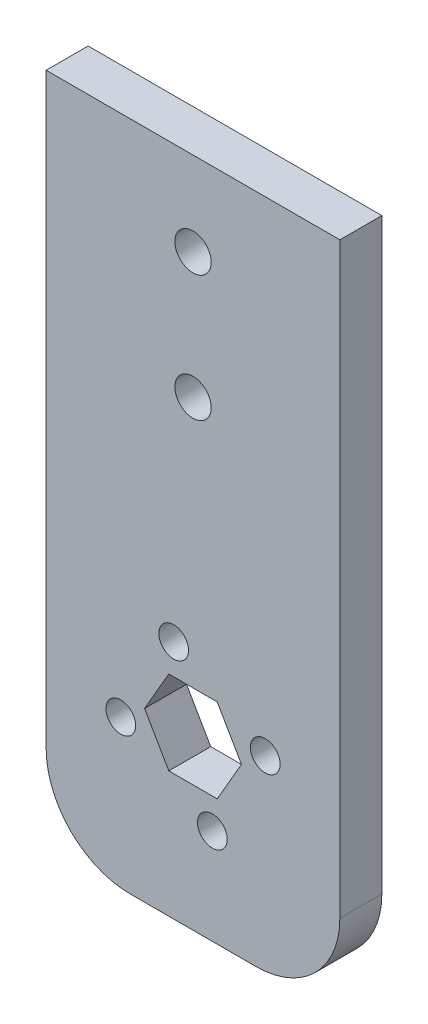
ISO-10303-21;
HEADER;
FILE_DESCRIPTION(('STEP AP214'),'2;1');
FILE_NAME('part.step','',(''),(''),'','','');
FILE_SCHEMA(('AUTOMOTIVE_DESIGN { 1 0 10303 214 1 1 1 1 }'));
ENDSEC;
DATA;
#1=APPLICATION_CONTEXT('core data for automotive mechanical design processes');
#2=APPLICATION_PROTOCOL_DEFINITION('international standard','automotive_design',2000,#1);
#3=PRODUCT_CONTEXT('',#1,'mechanical');
#4=PRODUCT('Part','Part','',(#3));
#5=PRODUCT_RELATED_PRODUCT_CATEGORY('part','',(#4));
#6=PRODUCT_DEFINITION_FORMATION('','',#4);
#7=PRODUCT_DEFINITION_CONTEXT('part definition',#1,'design');
#8=PRODUCT_DEFINITION('design','',#6,#7);
#9=PRODUCT_DEFINITION_SHAPE('','',#8);
#10=(LENGTH_UNIT() NAMED_UNIT(*) SI_UNIT(.MILLI.,.METRE.));
#11=(NAMED_UNIT(*) PLANE_ANGLE_UNIT() SI_UNIT($,.RADIAN.));
#12=(NAMED_UNIT(*) SI_UNIT($,.STERADIAN.) SOLID_ANGLE_UNIT());
#13=UNCERTAINTY_MEASURE_WITH_UNIT(LENGTH_MEASURE(1.E-05),#10,'distance_accuracy_value','');
#14=(GEOMETRIC_REPRESENTATION_CONTEXT(3) GLOBAL_UNCERTAINTY_ASSIGNED_CONTEXT((#13)) GLOBAL_UNIT_ASSIGNED_CONTEXT((#10,
#11,#12)) REPRESENTATION_CONTEXT('',''));
#15=CARTESIAN_POINT('',(0.,0.,0.));
#16=DIRECTION('',(0.,0.,1.));
#17=DIRECTION('',(1.,0.,0.));
#18=AXIS2_PLACEMENT_3D('',#15,#16,#17);
#19=CARTESIAN_POINT('',(0.,0.,6.35));
#20=DIRECTION('',(-1.,0.,0.));
#21=DIRECTION('',(0.,0.,1.));
#22=AXIS2_PLACEMENT_3D('',#19,#20,#21);
#23=PLANE('',#22);
#24=DIRECTION('',(0.,1.,0.));
#25=VECTOR('',#24,1.);
#26=CARTESIAN_POINT('',(0.,0.,6.35));
#27=LINE('',#26,#25);
#28=CARTESIAN_POINT('',(0.,12.7,6.35));
#29=VERTEX_POINT('',#28);
#30=CARTESIAN_POINT('',(0.,101.6,6.35));
#31=VERTEX_POINT('',#30);
#32=EDGE_CURVE('E193',#29,#31,#27,.T.);
#33=ORIENTED_EDGE('',*,*,#32,.F.);
#34=DIRECTION('',(0.,0.,-1.));
#35=VECTOR('',#34,1.);
#36=CARTESIAN_POINT('',(0.,12.7,6.35));
#37=LINE('',#36,#35);
#38=CARTESIAN_POINT('',(0.,12.7,0.));
#39=VERTEX_POINT('',#38);
#40=EDGE_CURVE('E11',#29,#39,#37,.T.);
#41=ORIENTED_EDGE('',*,*,#40,.T.);
#42=DIRECTION('',(0.,1.,0.));
#43=VECTOR('',#42,1.);
#44=CARTESIAN_POINT('',(0.,0.,0.));
#45=LINE('',#44,#43);
#46=CARTESIAN_POINT('',(0.,101.6,0.));
#47=VERTEX_POINT('',#46);
#48=EDGE_CURVE('E192',#39,#47,#45,.T.);
#49=ORIENTED_EDGE('',*,*,#48,.T.);
#50=DIRECTION('',(0.,0.,-1.));
#51=VECTOR('',#50,1.);
#52=CARTESIAN_POINT('',(0.,101.6,6.35));
#53=LINE('',#52,#51);
#54=EDGE_CURVE('E215',#31,#47,#53,.T.);
#55=ORIENTED_EDGE('',*,*,#54,.F.);
#56=EDGE_LOOP('',(#33,#41,#49,#55));
#57=FACE_BOUND('',#56,.T.);
#58=ADVANCED_FACE('F36',(#57),#23,.F.);
#59=CARTESIAN_POINT('',(0.,101.6,6.35));
#60=DIRECTION('',(0.,-1.,0.));
#61=DIRECTION('',(0.,0.,-1.));
#62=AXIS2_PLACEMENT_3D('',#59,#60,#61);
#63=PLANE('',#62);
#64=DIRECTION('',(-1.,0.,0.));
#65=VECTOR('',#64,1.);
#66=CARTESIAN_POINT('',(0.,101.6,0.));
#67=LINE('',#66,#65);
#68=CARTESIAN_POINT('',(-44.45,101.6,0.));
#69=VERTEX_POINT('',#68);
#70=EDGE_CURVE('E206',#47,#69,#67,.T.);
#71=ORIENTED_EDGE('',*,*,#70,.T.);
#72=DIRECTION('',(0.,0.,-1.));
#73=VECTOR('',#72,1.);
#74=CARTESIAN_POINT('',(-44.45,101.6,6.35));
#75=LINE('',#74,#73);
#76=CARTESIAN_POINT('',(-44.45,101.6,6.35));
#77=VERTEX_POINT('',#76);
#78=EDGE_CURVE('E204',#77,#69,#75,.T.);
#79=ORIENTED_EDGE('',*,*,#78,.F.);
#80=DIRECTION('',(-1.,0.,0.));
#81=VECTOR('',#80,1.);
#82=CARTESIAN_POINT('',(0.,101.6,6.35));
#83=LINE('',#82,#81);
#84=EDGE_CURVE('E195',#31,#77,#83,.T.);
#85=ORIENTED_EDGE('',*,*,#84,.F.);
#86=ORIENTED_EDGE('',*,*,#54,.T.);
#87=EDGE_LOOP('',(#71,#79,#85,#86));
#88=FACE_BOUND('',#87,.T.);
#89=ADVANCED_FACE('F252',(#88),#63,.F.);
#90=CARTESIAN_POINT('',(-44.45,0.,6.35));
#91=DIRECTION('',(1.,0.,0.));
#92=DIRECTION('',(0.,0.,-1.));
#93=AXIS2_PLACEMENT_3D('',#90,#91,#92);
#94=PLANE('',#93);
#95=DIRECTION('',(0.,-1.,0.));
#96=VECTOR('',#95,1.);
#97=CARTESIAN_POINT('',(-44.45,0.,0.));
#98=LINE('',#97,#96);
#99=CARTESIAN_POINT('',(-44.45,12.7,0.));
#100=VERTEX_POINT('',#99);
#101=EDGE_CURVE('E208',#69,#100,#98,.T.);
#102=ORIENTED_EDGE('',*,*,#101,.T.);
#103=DIRECTION('',(0.,0.,-1.));
#104=VECTOR('',#103,1.);
#105=CARTESIAN_POINT('',(-44.45,12.7,6.35));
#106=LINE('',#105,#104);
#107=CARTESIAN_POINT('',(-44.45,12.7,6.35));
#108=VERTEX_POINT('',#107);
#109=EDGE_CURVE('E227',#100,#108,#106,.F.);
#110=ORIENTED_EDGE('',*,*,#109,.T.);
#111=DIRECTION('',(0.,-1.,0.));
#112=VECTOR('',#111,1.);
#113=CARTESIAN_POINT('',(-44.45,0.,6.35));
#114=LINE('',#113,#112);
#115=EDGE_CURVE('E198',#77,#108,#114,.T.);
#116=ORIENTED_EDGE('',*,*,#115,.F.);
#117=ORIENTED_EDGE('',*,*,#78,.T.);
#118=EDGE_LOOP('',(#102,#110,#116,#117));
#119=FACE_BOUND('',#118,.T.);
#120=ADVANCED_FACE('F248',(#119),#94,.F.);
#121=CARTESIAN_POINT('',(0.,0.,6.35));
#122=DIRECTION('',(0.,1.,0.));
#123=DIRECTION('',(0.,0.,1.));
#124=AXIS2_PLACEMENT_3D('',#121,#122,#123);
#125=PLANE('',#124);
#126=DIRECTION('',(1.,0.,0.));
#127=VECTOR('',#126,1.);
#128=CARTESIAN_POINT('',(0.,0.,6.35));
#129=LINE('',#128,#127);
#130=CARTESIAN_POINT('',(-31.75,0.,6.35));
#131=VERTEX_POINT('',#130);
#132=CARTESIAN_POINT('',(-12.7,0.,6.35));
#133=VERTEX_POINT('',#132);
#134=EDGE_CURVE('E201',#131,#133,#129,.T.);
#135=ORIENTED_EDGE('',*,*,#134,.F.);
#136=DIRECTION('',(0.,0.,-1.));
#137=VECTOR('',#136,1.);
#138=CARTESIAN_POINT('',(-31.75,0.,6.35));
#139=LINE('',#138,#137);
#140=CARTESIAN_POINT('',(-31.75,0.,0.));
#141=VERTEX_POINT('',#140);
#142=EDGE_CURVE('E220',#131,#141,#139,.T.);
#143=ORIENTED_EDGE('',*,*,#142,.T.);
#144=DIRECTION('',(1.,0.,0.));
#145=VECTOR('',#144,1.);
#146=CARTESIAN_POINT('',(0.,0.,0.));
#147=LINE('',#146,#145);
#148=CARTESIAN_POINT('',(-12.7,0.,0.));
#149=VERTEX_POINT('',#148);
#150=EDGE_CURVE('E196',#141,#149,#147,.T.);
#151=ORIENTED_EDGE('',*,*,#150,.T.);
#152=DIRECTION('',(0.,0.,-1.));
#153=VECTOR('',#152,1.);
#154=CARTESIAN_POINT('',(-12.7,0.,6.35));
#155=LINE('',#154,#153);
#156=EDGE_CURVE('E218',#149,#133,#155,.F.);
#157=ORIENTED_EDGE('',*,*,#156,.T.);
#158=EDGE_LOOP('',(#135,#143,#151,#157));
#159=FACE_BOUND('',#158,.T.);
#160=ADVANCED_FACE('F240',(#159),#125,.F.);
#161=CARTESIAN_POINT('',(0.,0.,6.35));
#162=DIRECTION('',(0.,0.,1.));
#163=DIRECTION('',(1.,0.,0.));
#164=AXIS2_PLACEMENT_3D('',#161,#162,#163);
#165=PLANE('',#164);
#166=CARTESIAN_POINT('',(-11.2967967697244,28.3282032302755,6.35));
#167=DIRECTION('',(0.,0.,-1.));
#168=DIRECTION('',(-1.,0.,0.));
#169=AXIS2_PLACEMENT_3D('',#166,#167,#168);
#170=CIRCLE('',#169,2.25);
#171=CARTESIAN_POINT('',(-13.5467967697244,28.3282032302755,6.35));
#172=VERTEX_POINT('',#171);
#173=EDGE_CURVE('E327',#172,#172,#170,.T.);
#174=ORIENTED_EDGE('',*,*,#173,.T.);
#175=EDGE_LOOP('',(#174));
#176=FACE_BOUND('',#175,.T.);
#177=CARTESIAN_POINT('',(-25.1532032302754,36.3282032302756,6.35));
#178=DIRECTION('',(0.,0.,-1.));
#179=DIRECTION('',(-1.,0.,0.));
#180=AXIS2_PLACEMENT_3D('',#177,#178,#179);
#181=CIRCLE('',#180,2.25);
#182=CARTESIAN_POINT('',(-27.4032032302754,36.3282032302756,6.35));
#183=VERTEX_POINT('',#182);
#184=EDGE_CURVE('E337',#183,#183,#181,.T.);
#185=ORIENTED_EDGE('',*,*,#184,.T.);
#186=EDGE_LOOP('',(#185));
#187=FACE_BOUND('',#186,.T.);
#188=CARTESIAN_POINT('',(-33.1532032302755,22.4717967697245,6.35));
#189=DIRECTION('',(0.,0.,-1.));
#190=DIRECTION('',(-1.,0.,0.));
#191=AXIS2_PLACEMENT_3D('',#188,#189,#190);
#192=CIRCLE('',#191,2.25);
#193=CARTESIAN_POINT('',(-35.4032032302755,22.4717967697245,6.35));
#194=VERTEX_POINT('',#193);
#195=EDGE_CURVE('E343',#194,#194,#192,.T.);
#196=ORIENTED_EDGE('',*,*,#195,.T.);
#197=EDGE_LOOP('',(#196));
#198=FACE_BOUND('',#197,.T.);
#199=CARTESIAN_POINT('',(-19.2967967697245,14.4717967697245,6.35));
#200=DIRECTION('',(0.,0.,-1.));
#201=DIRECTION('',(-1.,0.,0.));
#202=AXIS2_PLACEMENT_3D('',#199,#200,#201);
#203=CIRCLE('',#202,2.25);
#204=CARTESIAN_POINT('',(-21.5467967697245,14.4717967697245,6.35));
#205=VERTEX_POINT('',#204);
#206=EDGE_CURVE('E150',#205,#205,#203,.T.);
#207=ORIENTED_EDGE('',*,*,#206,.T.);
#208=EDGE_LOOP('',(#207));
#209=FACE_BOUND('',#208,.T.);
#210=DIRECTION('',(0.499999999999999,0.866025403784439,0.));
#211=VECTOR('',#210,1.);
#212=CARTESIAN_POINT('',(-18.5588257906459,19.05,6.35));
#213=LINE('',#212,#211);
#214=CARTESIAN_POINT('',(-18.5588257906459,19.05,6.35));
#215=VERTEX_POINT('',#214);
#216=CARTESIAN_POINT('',(-14.8926515812918,25.4,6.35));
#217=VERTEX_POINT('',#216);
#218=EDGE_CURVE('E51',#215,#217,#213,.T.);
#219=ORIENTED_EDGE('',*,*,#218,.F.);
#220=DIRECTION('',(1.,0.,0.));
#221=VECTOR('',#220,1.);
#222=CARTESIAN_POINT('',(-25.8911742093541,19.05,6.35));
#223=LINE('',#222,#221);
#224=CARTESIAN_POINT('',(-25.8911742093541,19.05,6.35));
#225=VERTEX_POINT('',#224);
#226=EDGE_CURVE('E144',#225,#215,#223,.T.);
#227=ORIENTED_EDGE('',*,*,#226,.F.);
#228=DIRECTION('',(0.5,-0.866025403784439,0.));
#229=VECTOR('',#228,1.);
#230=CARTESIAN_POINT('',(-29.5573484187082,25.4,6.35));
#231=LINE('',#230,#229);
#232=CARTESIAN_POINT('',(-29.5573484187082,25.4,6.35));
#233=VERTEX_POINT('',#232);
#234=EDGE_CURVE('E147',#233,#225,#231,.T.);
#235=ORIENTED_EDGE('',*,*,#234,.F.);
#236=DIRECTION('',(-0.499999999999999,-0.866025403784439,0.));
#237=VECTOR('',#236,1.);
#238=CARTESIAN_POINT('',(-25.8911742093541,31.75,6.35));
#239=LINE('',#238,#237);
#240=CARTESIAN_POINT('',(-25.8911742093541,31.75,6.35));
#241=VERTEX_POINT('',#240);
#242=EDGE_CURVE('E166',#241,#233,#239,.T.);
#243=ORIENTED_EDGE('',*,*,#242,.F.);
#244=DIRECTION('',(-1.,0.,0.));
#245=VECTOR('',#244,1.);
#246=CARTESIAN_POINT('',(-18.5588257906459,31.75,6.35));
#247=LINE('',#246,#245);
#248=CARTESIAN_POINT('',(-18.5588257906459,31.75,6.35));
#249=VERTEX_POINT('',#248);
#250=EDGE_CURVE('E163',#249,#241,#247,.T.);
#251=ORIENTED_EDGE('',*,*,#250,.F.);
#252=DIRECTION('',(-0.5,0.866025403784439,0.));
#253=VECTOR('',#252,1.);
#254=CARTESIAN_POINT('',(-14.8926515812918,25.4,6.35));
#255=LINE('',#254,#253);
#256=EDGE_CURVE('E161',#217,#249,#255,.T.);
#257=ORIENTED_EDGE('',*,*,#256,.F.);
#258=EDGE_LOOP('',(#219,#227,#235,#243,#251,#257));
#259=FACE_BOUND('',#258,.T.);
#260=CARTESIAN_POINT('',(-22.225,88.9,6.35));
#261=DIRECTION('',(0.,0.,-1.));
#262=DIRECTION('',(-1.,0.,0.));
#263=AXIS2_PLACEMENT_3D('',#260,#261,#262);
#264=CIRCLE('',#263,2.75);
#265=CARTESIAN_POINT('',(-24.975,88.9,6.35));
#266=VERTEX_POINT('',#265);
#267=EDGE_CURVE('E183',#266,#266,#264,.T.);
#268=ORIENTED_EDGE('',*,*,#267,.T.);
#269=EDGE_LOOP('',(#268));
#270=FACE_BOUND('',#269,.T.);
#271=CARTESIAN_POINT('',(-22.225,69.85,6.35));
#272=DIRECTION('',(0.,0.,-1.));
#273=DIRECTION('',(-1.,0.,0.));
#274=AXIS2_PLACEMENT_3D('',#271,#272,#273);
#275=CIRCLE('',#274,2.75);
#276=CARTESIAN_POINT('',(-24.975,69.85,6.35));
#277=VERTEX_POINT('',#276);
#278=EDGE_CURVE('E189',#277,#277,#275,.T.);
#279=ORIENTED_EDGE('',*,*,#278,.T.);
#280=EDGE_LOOP('',(#279));
#281=FACE_BOUND('',#280,.T.);
#282=ORIENTED_EDGE('',*,*,#115,.T.);
#283=CARTESIAN_POINT('',(-31.75,12.7,6.35));
#284=DIRECTION('',(0.,0.,1.));
#285=DIRECTION('',(1.,0.,0.));
#286=AXIS2_PLACEMENT_3D('',#283,#284,#285);
#287=CIRCLE('',#286,12.7);
#288=EDGE_CURVE('E44',#108,#131,#287,.T.);
#289=ORIENTED_EDGE('',*,*,#288,.T.);
#290=ORIENTED_EDGE('',*,*,#134,.T.);
#291=CARTESIAN_POINT('',(-12.7,12.7,6.35));
#292=DIRECTION('',(0.,0.,1.));
#293=DIRECTION('',(1.,0.,0.));
#294=AXIS2_PLACEMENT_3D('',#291,#292,#293);
#295=CIRCLE('',#294,12.7);
#296=EDGE_CURVE('E229',#133,#29,#295,.T.);
#297=ORIENTED_EDGE('',*,*,#296,.T.);
#298=ORIENTED_EDGE('',*,*,#32,.T.);
#299=ORIENTED_EDGE('',*,*,#84,.T.);
#300=EDGE_LOOP('',(#282,#289,#290,#297,#298,#299));
#301=FACE_BOUND('',#300,.T.);
#302=ADVANCED_FACE('F233',(#176,#187,#198,#209,#259,#270,#281,#301),#165,.T.);
#303=CARTESIAN_POINT('',(0.,0.,0.));
#304=DIRECTION('',(0.,0.,1.));
#305=DIRECTION('',(1.,0.,0.));
#306=AXIS2_PLACEMENT_3D('',#303,#304,#305);
#307=PLANE('',#306);
#308=CARTESIAN_POINT('',(-11.2967967697244,28.3282032302755,0.));
#309=DIRECTION('',(0.,0.,-1.));
#310=DIRECTION('',(-1.,0.,0.));
#311=AXIS2_PLACEMENT_3D('',#308,#309,#310);
#312=CIRCLE('',#311,2.25);
#313=CARTESIAN_POINT('',(-13.5467967697244,28.3282032302755,0.));
#314=VERTEX_POINT('',#313);
#315=EDGE_CURVE('E330',#314,#314,#312,.T.);
#316=ORIENTED_EDGE('',*,*,#315,.F.);
#317=EDGE_LOOP('',(#316));
#318=FACE_BOUND('',#317,.T.);
#319=CARTESIAN_POINT('',(-25.1532032302754,36.3282032302756,0.));
#320=DIRECTION('',(0.,0.,-1.));
#321=DIRECTION('',(-1.,0.,0.));
#322=AXIS2_PLACEMENT_3D('',#319,#320,#321);
#323=CIRCLE('',#322,2.25);
#324=CARTESIAN_POINT('',(-27.4032032302754,36.3282032302756,0.));
#325=VERTEX_POINT('',#324);
#326=EDGE_CURVE('E332',#325,#325,#323,.T.);
#327=ORIENTED_EDGE('',*,*,#326,.F.);
#328=EDGE_LOOP('',(#327));
#329=FACE_BOUND('',#328,.T.);
#330=CARTESIAN_POINT('',(-33.1532032302755,22.4717967697245,0.));
#331=DIRECTION('',(0.,0.,-1.));
#332=DIRECTION('',(-1.,0.,0.));
#333=AXIS2_PLACEMENT_3D('',#330,#331,#332);
#334=CIRCLE('',#333,2.25);
#335=CARTESIAN_POINT('',(-35.4032032302755,22.4717967697245,0.));
#336=VERTEX_POINT('',#335);
#337=EDGE_CURVE('E340',#336,#336,#334,.T.);
#338=ORIENTED_EDGE('',*,*,#337,.F.);
#339=EDGE_LOOP('',(#338));
#340=FACE_BOUND('',#339,.T.);
#341=CARTESIAN_POINT('',(-19.2967967697245,14.4717967697245,0.));
#342=DIRECTION('',(0.,0.,-1.));
#343=DIRECTION('',(-1.,0.,0.));
#344=AXIS2_PLACEMENT_3D('',#341,#342,#343);
#345=CIRCLE('',#344,2.25);
#346=CARTESIAN_POINT('',(-21.5467967697245,14.4717967697245,0.));
#347=VERTEX_POINT('',#346);
#348=EDGE_CURVE('E345',#347,#347,#345,.T.);
#349=ORIENTED_EDGE('',*,*,#348,.F.);
#350=EDGE_LOOP('',(#349));
#351=FACE_BOUND('',#350,.T.);
#352=DIRECTION('',(1.,0.,0.));
#353=VECTOR('',#352,1.);
#354=CARTESIAN_POINT('',(-25.8911742093541,19.05,0.));
#355=LINE('',#354,#353);
#356=CARTESIAN_POINT('',(-25.8911742093541,19.05,0.));
#357=VERTEX_POINT('',#356);
#358=CARTESIAN_POINT('',(-18.5588257906459,19.05,0.));
#359=VERTEX_POINT('',#358);
#360=EDGE_CURVE('E133',#357,#359,#355,.T.);
#361=ORIENTED_EDGE('',*,*,#360,.T.);
#362=DIRECTION('',(0.499999999999999,0.866025403784439,0.));
#363=VECTOR('',#362,1.);
#364=CARTESIAN_POINT('',(-18.5588257906459,19.05,0.));
#365=LINE('',#364,#363);
#366=CARTESIAN_POINT('',(-14.8926515812918,25.4,0.));
#367=VERTEX_POINT('',#366);
#368=EDGE_CURVE('E127',#359,#367,#365,.T.);
#369=ORIENTED_EDGE('',*,*,#368,.T.);
#370=DIRECTION('',(-0.5,0.866025403784439,0.));
#371=VECTOR('',#370,1.);
#372=CARTESIAN_POINT('',(-14.8926515812918,25.4,0.));
#373=LINE('',#372,#371);
#374=CARTESIAN_POINT('',(-18.5588257906459,31.75,0.));
#375=VERTEX_POINT('',#374);
#376=EDGE_CURVE('E136',#367,#375,#373,.T.);
#377=ORIENTED_EDGE('',*,*,#376,.T.);
#378=DIRECTION('',(-1.,0.,0.));
#379=VECTOR('',#378,1.);
#380=CARTESIAN_POINT('',(-18.5588257906459,31.75,0.));
#381=LINE('',#380,#379);
#382=CARTESIAN_POINT('',(-25.8911742093541,31.75,0.));
#383=VERTEX_POINT('',#382);
#384=EDGE_CURVE('E59',#375,#383,#381,.T.);
#385=ORIENTED_EDGE('',*,*,#384,.T.);
#386=DIRECTION('',(-0.499999999999999,-0.866025403784439,0.));
#387=VECTOR('',#386,1.);
#388=CARTESIAN_POINT('',(-25.8911742093541,31.75,0.));
#389=LINE('',#388,#387);
#390=CARTESIAN_POINT('',(-29.5573484187082,25.4,0.));
#391=VERTEX_POINT('',#390);
#392=EDGE_CURVE('E154',#383,#391,#389,.T.);
#393=ORIENTED_EDGE('',*,*,#392,.T.);
#394=DIRECTION('',(0.5,-0.866025403784439,0.));
#395=VECTOR('',#394,1.);
#396=CARTESIAN_POINT('',(-29.5573484187082,25.4,0.));
#397=LINE('',#396,#395);
#398=EDGE_CURVE('E157',#391,#357,#397,.T.);
#399=ORIENTED_EDGE('',*,*,#398,.T.);
#400=EDGE_LOOP('',(#361,#369,#377,#385,#393,#399));
#401=FACE_BOUND('',#400,.T.);
#402=CARTESIAN_POINT('',(-22.225,88.9,0.));
#403=DIRECTION('',(0.,0.,-1.));
#404=DIRECTION('',(-1.,0.,0.));
#405=AXIS2_PLACEMENT_3D('',#402,#403,#404);
#406=CIRCLE('',#405,2.75);
#407=CARTESIAN_POINT('',(-24.975,88.9,0.));
#408=VERTEX_POINT('',#407);
#409=EDGE_CURVE('E173',#408,#408,#406,.T.);
#410=ORIENTED_EDGE('',*,*,#409,.F.);
#411=EDGE_LOOP('',(#410));
#412=FACE_BOUND('',#411,.T.);
#413=CARTESIAN_POINT('',(-22.225,69.85,0.));
#414=DIRECTION('',(0.,0.,-1.));
#415=DIRECTION('',(-1.,0.,0.));
#416=AXIS2_PLACEMENT_3D('',#413,#414,#415);
#417=CIRCLE('',#416,2.75);
#418=CARTESIAN_POINT('',(-24.975,69.85,0.));
#419=VERTEX_POINT('',#418);
#420=EDGE_CURVE('E186',#419,#419,#417,.T.);
#421=ORIENTED_EDGE('',*,*,#420,.F.);
#422=EDGE_LOOP('',(#421));
#423=FACE_BOUND('',#422,.T.);
#424=ORIENTED_EDGE('',*,*,#150,.F.);
#425=CARTESIAN_POINT('',(-31.75,12.7,0.));
#426=DIRECTION('',(0.,0.,1.));
#427=DIRECTION('',(1.,0.,0.));
#428=AXIS2_PLACEMENT_3D('',#425,#426,#427);
#429=CIRCLE('',#428,12.7);
#430=EDGE_CURVE('E225',#141,#100,#429,.F.);
#431=ORIENTED_EDGE('',*,*,#430,.T.);
#432=ORIENTED_EDGE('',*,*,#101,.F.);
#433=ORIENTED_EDGE('',*,*,#70,.F.);
#434=ORIENTED_EDGE('',*,*,#48,.F.);
#435=CARTESIAN_POINT('',(-12.7,12.7,0.));
#436=DIRECTION('',(0.,0.,1.));
#437=DIRECTION('',(1.,0.,0.));
#438=AXIS2_PLACEMENT_3D('',#435,#436,#437);
#439=CIRCLE('',#438,12.7);
#440=EDGE_CURVE('E223',#39,#149,#439,.F.);
#441=ORIENTED_EDGE('',*,*,#440,.T.);
#442=EDGE_LOOP('',(#424,#431,#432,#433,#434,#441));
#443=FACE_BOUND('',#442,.T.);
#444=ADVANCED_FACE('F140',(#318,#329,#340,#351,#401,#412,#423,#443),#307,.F.);
#445=CARTESIAN_POINT('',(-31.75,12.7,6.35));
#446=DIRECTION('',(0.,0.,-1.));
#447=DIRECTION('',(-1.,0.,0.));
#448=AXIS2_PLACEMENT_3D('',#445,#446,#447);
#449=CYLINDRICAL_SURFACE('',#448,12.7);
#450=ORIENTED_EDGE('',*,*,#288,.F.);
#451=ORIENTED_EDGE('',*,*,#109,.F.);
#452=ORIENTED_EDGE('',*,*,#430,.F.);
#453=ORIENTED_EDGE('',*,*,#142,.F.);
#454=EDGE_LOOP('',(#450,#451,#452,#453));
#455=FACE_BOUND('',#454,.T.);
#456=ADVANCED_FACE('F243',(#455),#449,.T.);
#457=CARTESIAN_POINT('',(-12.7,12.7,6.35));
#458=DIRECTION('',(0.,0.,-1.));
#459=DIRECTION('',(-1.,0.,0.));
#460=AXIS2_PLACEMENT_3D('',#457,#458,#459);
#461=CYLINDRICAL_SURFACE('',#460,12.7);
#462=ORIENTED_EDGE('',*,*,#296,.F.);
#463=ORIENTED_EDGE('',*,*,#156,.F.);
#464=ORIENTED_EDGE('',*,*,#440,.F.);
#465=ORIENTED_EDGE('',*,*,#40,.F.);
#466=EDGE_LOOP('',(#462,#463,#464,#465));
#467=FACE_BOUND('',#466,.T.);
#468=ADVANCED_FACE('F38',(#467),#461,.T.);
#469=CARTESIAN_POINT('',(-22.225,69.85,0.));
#470=DIRECTION('',(0.,0.,-1.));
#471=DIRECTION('',(-1.,0.,0.));
#472=AXIS2_PLACEMENT_3D('',#469,#470,#471);
#473=CYLINDRICAL_SURFACE('',#472,2.75);
#474=ORIENTED_EDGE('',*,*,#278,.F.);
#475=EDGE_LOOP('',(#474));
#476=FACE_BOUND('',#475,.T.);
#477=ORIENTED_EDGE('',*,*,#420,.T.);
#478=EDGE_LOOP('',(#477));
#479=FACE_BOUND('',#478,.T.);
#480=ADVANCED_FACE('F260',(#476,#479),#473,.F.);
#481=CARTESIAN_POINT('',(-22.225,88.9,0.));
#482=DIRECTION('',(0.,0.,-1.));
#483=DIRECTION('',(-1.,0.,0.));
#484=AXIS2_PLACEMENT_3D('',#481,#482,#483);
#485=CYLINDRICAL_SURFACE('',#484,2.75);
#486=ORIENTED_EDGE('',*,*,#267,.F.);
#487=EDGE_LOOP('',(#486));
#488=FACE_BOUND('',#487,.T.);
#489=ORIENTED_EDGE('',*,*,#409,.T.);
#490=EDGE_LOOP('',(#489));
#491=FACE_BOUND('',#490,.T.);
#492=ADVANCED_FACE('F265',(#488,#491),#485,.F.);
#493=CARTESIAN_POINT('',(-18.5588257906459,19.05,0.));
#494=DIRECTION('',(0.866025403784439,-0.5,0.));
#495=DIRECTION('',(0.5,0.866025403784439,0.));
#496=AXIS2_PLACEMENT_3D('',#493,#494,#495);
#497=PLANE('',#496);
#498=ORIENTED_EDGE('',*,*,#218,.T.);
#499=DIRECTION('',(0.,0.,1.));
#500=VECTOR('',#499,1.);
#501=CARTESIAN_POINT('',(-14.8926515812918,25.4,0.));
#502=LINE('',#501,#500);
#503=EDGE_CURVE('E123',#367,#217,#502,.T.);
#504=ORIENTED_EDGE('',*,*,#503,.F.);
#505=ORIENTED_EDGE('',*,*,#368,.F.);
#506=DIRECTION('',(0.,0.,1.));
#507=VECTOR('',#506,1.);
#508=CARTESIAN_POINT('',(-18.5588257906459,19.05,0.));
#509=LINE('',#508,#507);
#510=EDGE_CURVE('E171',#359,#215,#509,.T.);
#511=ORIENTED_EDGE('',*,*,#510,.T.);
#512=EDGE_LOOP('',(#498,#504,#505,#511));
#513=FACE_BOUND('',#512,.T.);
#514=ADVANCED_FACE('F125',(#513),#497,.F.);
#515=CARTESIAN_POINT('',(-25.8911742093541,19.05,0.));
#516=DIRECTION('',(0.,-1.,0.));
#517=DIRECTION('',(0.,0.,-1.));
#518=AXIS2_PLACEMENT_3D('',#515,#516,#517);
#519=PLANE('',#518);
#520=ORIENTED_EDGE('',*,*,#226,.T.);
#521=ORIENTED_EDGE('',*,*,#510,.F.);
#522=ORIENTED_EDGE('',*,*,#360,.F.);
#523=DIRECTION('',(0.,0.,1.));
#524=VECTOR('',#523,1.);
#525=CARTESIAN_POINT('',(-25.8911742093541,19.05,0.));
#526=LINE('',#525,#524);
#527=EDGE_CURVE('E174',#357,#225,#526,.T.);
#528=ORIENTED_EDGE('',*,*,#527,.T.);
#529=EDGE_LOOP('',(#520,#521,#522,#528));
#530=FACE_BOUND('',#529,.T.);
#531=ADVANCED_FACE('F290',(#530),#519,.F.);
#532=CARTESIAN_POINT('',(-29.5573484187082,25.4,0.));
#533=DIRECTION('',(-0.866025403784439,-0.5,0.));
#534=DIRECTION('',(0.5,-0.866025403784439,0.));
#535=AXIS2_PLACEMENT_3D('',#532,#533,#534);
#536=PLANE('',#535);
#537=ORIENTED_EDGE('',*,*,#234,.T.);
#538=ORIENTED_EDGE('',*,*,#527,.F.);
#539=ORIENTED_EDGE('',*,*,#398,.F.);
#540=DIRECTION('',(0.,0.,1.));
#541=VECTOR('',#540,1.);
#542=CARTESIAN_POINT('',(-29.5573484187082,25.4,0.));
#543=LINE('',#542,#541);
#544=EDGE_CURVE('E176',#391,#233,#543,.T.);
#545=ORIENTED_EDGE('',*,*,#544,.T.);
#546=EDGE_LOOP('',(#537,#538,#539,#545));
#547=FACE_BOUND('',#546,.T.);
#548=ADVANCED_FACE('F300',(#547),#536,.F.);
#549=CARTESIAN_POINT('',(-25.8911742093541,31.75,0.));
#550=DIRECTION('',(-0.866025403784439,0.499999999999999,0.));
#551=DIRECTION('',(-0.499999999999999,-0.866025403784439,0.));
#552=AXIS2_PLACEMENT_3D('',#549,#550,#551);
#553=PLANE('',#552);
#554=ORIENTED_EDGE('',*,*,#242,.T.);
#555=ORIENTED_EDGE('',*,*,#544,.F.);
#556=ORIENTED_EDGE('',*,*,#392,.F.);
#557=DIRECTION('',(0.,0.,1.));
#558=VECTOR('',#557,1.);
#559=CARTESIAN_POINT('',(-25.8911742093541,31.75,0.));
#560=LINE('',#559,#558);
#561=EDGE_CURVE('E178',#383,#241,#560,.T.);
#562=ORIENTED_EDGE('',*,*,#561,.T.);
#563=EDGE_LOOP('',(#554,#555,#556,#562));
#564=FACE_BOUND('',#563,.T.);
#565=ADVANCED_FACE('F297',(#564),#553,.F.);
#566=CARTESIAN_POINT('',(-18.5588257906459,31.75,0.));
#567=DIRECTION('',(0.,1.,0.));
#568=DIRECTION('',(0.,0.,1.));
#569=AXIS2_PLACEMENT_3D('',#566,#567,#568);
#570=PLANE('',#569);
#571=ORIENTED_EDGE('',*,*,#250,.T.);
#572=ORIENTED_EDGE('',*,*,#561,.F.);
#573=ORIENTED_EDGE('',*,*,#384,.F.);
#574=DIRECTION('',(0.,0.,1.));
#575=VECTOR('',#574,1.);
#576=CARTESIAN_POINT('',(-18.5588257906459,31.75,0.));
#577=LINE('',#576,#575);
#578=EDGE_CURVE('E132',#375,#249,#577,.T.);
#579=ORIENTED_EDGE('',*,*,#578,.T.);
#580=EDGE_LOOP('',(#571,#572,#573,#579));
#581=FACE_BOUND('',#580,.T.);
#582=ADVANCED_FACE('F294',(#581),#570,.F.);
#583=CARTESIAN_POINT('',(-14.8926515812918,25.4,0.));
#584=DIRECTION('',(0.866025403784439,0.5,0.));
#585=DIRECTION('',(-0.5,0.866025403784439,0.));
#586=AXIS2_PLACEMENT_3D('',#583,#584,#585);
#587=PLANE('',#586);
#588=ORIENTED_EDGE('',*,*,#256,.T.);
#589=ORIENTED_EDGE('',*,*,#578,.F.);
#590=ORIENTED_EDGE('',*,*,#376,.F.);
#591=ORIENTED_EDGE('',*,*,#503,.T.);
#592=EDGE_LOOP('',(#588,#589,#590,#591));
#593=FACE_BOUND('',#592,.T.);
#594=ADVANCED_FACE('F137',(#593),#587,.F.);
#595=CARTESIAN_POINT('',(-19.2967967697245,14.4717967697245,0.));
#596=DIRECTION('',(0.,0.,-1.));
#597=DIRECTION('',(-1.,0.,0.));
#598=AXIS2_PLACEMENT_3D('',#595,#596,#597);
#599=CYLINDRICAL_SURFACE('',#598,2.25);
#600=ORIENTED_EDGE('',*,*,#206,.F.);
#601=EDGE_LOOP('',(#600));
#602=FACE_BOUND('',#601,.T.);
#603=ORIENTED_EDGE('',*,*,#348,.T.);
#604=EDGE_LOOP('',(#603));
#605=FACE_BOUND('',#604,.T.);
#606=ADVANCED_FACE('F293',(#602,#605),#599,.F.);
#607=CARTESIAN_POINT('',(-33.1532032302755,22.4717967697245,0.));
#608=DIRECTION('',(0.,0.,-1.));
#609=DIRECTION('',(-1.,0.,0.));
#610=AXIS2_PLACEMENT_3D('',#607,#608,#609);
#611=CYLINDRICAL_SURFACE('',#610,2.25);
#612=ORIENTED_EDGE('',*,*,#195,.F.);
#613=EDGE_LOOP('',(#612));
#614=FACE_BOUND('',#613,.T.);
#615=ORIENTED_EDGE('',*,*,#337,.T.);
#616=EDGE_LOOP('',(#615));
#617=FACE_BOUND('',#616,.T.);
#618=ADVANCED_FACE('F310',(#614,#617),#611,.F.);
#619=CARTESIAN_POINT('',(-25.1532032302754,36.3282032302756,0.));
#620=DIRECTION('',(0.,0.,-1.));
#621=DIRECTION('',(-1.,0.,0.));
#622=AXIS2_PLACEMENT_3D('',#619,#620,#621);
#623=CYLINDRICAL_SURFACE('',#622,2.25);
#624=ORIENTED_EDGE('',*,*,#184,.F.);
#625=EDGE_LOOP('',(#624));
#626=FACE_BOUND('',#625,.T.);
#627=ORIENTED_EDGE('',*,*,#326,.T.);
#628=EDGE_LOOP('',(#627));
#629=FACE_BOUND('',#628,.T.);
#630=ADVANCED_FACE('F314',(#626,#629),#623,.F.);
#631=CARTESIAN_POINT('',(-11.2967967697244,28.3282032302755,0.));
#632=DIRECTION('',(0.,0.,-1.));
#633=DIRECTION('',(-1.,0.,0.));
#634=AXIS2_PLACEMENT_3D('',#631,#632,#633);
#635=CYLINDRICAL_SURFACE('',#634,2.25);
#636=ORIENTED_EDGE('',*,*,#173,.F.);
#637=EDGE_LOOP('',(#636));
#638=FACE_BOUND('',#637,.T.);
#639=ORIENTED_EDGE('',*,*,#315,.T.);
#640=EDGE_LOOP('',(#639));
#641=FACE_BOUND('',#640,.T.);
#642=ADVANCED_FACE('F318',(#638,#641),#635,.F.);
#643=CLOSED_SHELL('',(#58,#89,#120,#160,#302,#444,#456,#468,#480,#492,#514,#531,#548,#565,#582,
#594,#606,#618,#630,#642));
#644=MANIFOLD_SOLID_BREP('B2',#643);
#645=ADVANCED_BREP_SHAPE_REPRESENTATION('',(#18,#644),#14);
#646=SHAPE_DEFINITION_REPRESENTATION(#9,#645);
ENDSEC;
END-ISO-10303-21;
